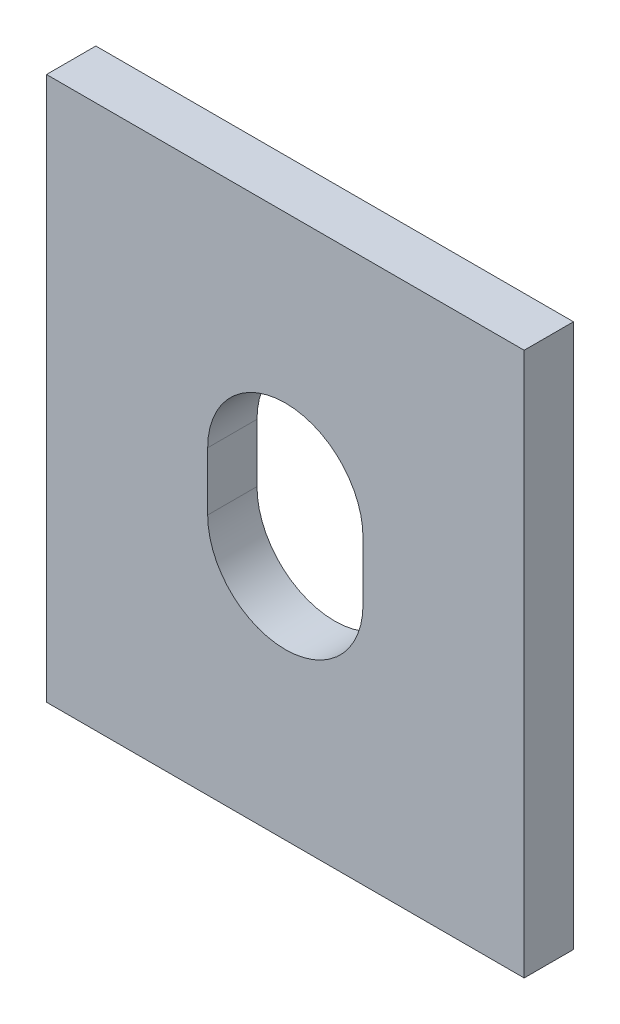
ISO-10303-21;
HEADER;
FILE_DESCRIPTION(('STEP AP214'),'2;1');
FILE_NAME('part.step','',(''),(''),'','','');
FILE_SCHEMA(('AUTOMOTIVE_DESIGN { 1 0 10303 214 1 1 1 1 }'));
ENDSEC;
DATA;
#1=APPLICATION_CONTEXT('core data for automotive mechanical design processes');
#2=APPLICATION_PROTOCOL_DEFINITION('international standard','automotive_design',2000,#1);
#3=PRODUCT_CONTEXT('',#1,'mechanical');
#4=PRODUCT('Part','Part','',(#3));
#5=PRODUCT_RELATED_PRODUCT_CATEGORY('part','',(#4));
#6=PRODUCT_DEFINITION_FORMATION('','',#4);
#7=PRODUCT_DEFINITION_CONTEXT('part definition',#1,'design');
#8=PRODUCT_DEFINITION('design','',#6,#7);
#9=PRODUCT_DEFINITION_SHAPE('','',#8);
#10=(LENGTH_UNIT() NAMED_UNIT(*) SI_UNIT(.MILLI.,.METRE.));
#11=(NAMED_UNIT(*) PLANE_ANGLE_UNIT() SI_UNIT($,.RADIAN.));
#12=(NAMED_UNIT(*) SI_UNIT($,.STERADIAN.) SOLID_ANGLE_UNIT());
#13=UNCERTAINTY_MEASURE_WITH_UNIT(LENGTH_MEASURE(1.E-05),#10,'distance_accuracy_value','');
#14=(GEOMETRIC_REPRESENTATION_CONTEXT(3) GLOBAL_UNCERTAINTY_ASSIGNED_CONTEXT((#13)) GLOBAL_UNIT_ASSIGNED_CONTEXT((#10,
#11,#12)) REPRESENTATION_CONTEXT('',''));
#15=CARTESIAN_POINT('',(0.,0.,0.));
#16=DIRECTION('',(0.,0.,1.));
#17=DIRECTION('',(1.,0.,0.));
#18=AXIS2_PLACEMENT_3D('',#15,#16,#17);
#19=CARTESIAN_POINT('',(-123.,140.,25.4));
#20=DIRECTION('',(1.,0.,0.));
#21=DIRECTION('',(0.,1.,0.));
#22=AXIS2_PLACEMENT_3D('',#19,#20,#21);
#23=PLANE('',#22);
#24=DIRECTION('',(0.,-1.,0.));
#25=VECTOR('',#24,1.);
#26=CARTESIAN_POINT('',(-123.,140.,0.));
#27=LINE('',#26,#25);
#28=CARTESIAN_POINT('',(-123.,140.,0.));
#29=VERTEX_POINT('',#28);
#30=CARTESIAN_POINT('',(-123.,-140.,0.));
#31=VERTEX_POINT('',#30);
#32=EDGE_CURVE('E129',#29,#31,#27,.T.);
#33=ORIENTED_EDGE('',*,*,#32,.T.);
#34=DIRECTION('',(0.,0.,-1.));
#35=VECTOR('',#34,1.);
#36=CARTESIAN_POINT('',(-123.,-140.,25.4));
#37=LINE('',#36,#35);
#38=CARTESIAN_POINT('',(-123.,-140.,25.4));
#39=VERTEX_POINT('',#38);
#40=EDGE_CURVE('E11',#39,#31,#37,.T.);
#41=ORIENTED_EDGE('',*,*,#40,.F.);
#42=DIRECTION('',(0.,-1.,0.));
#43=VECTOR('',#42,1.);
#44=CARTESIAN_POINT('',(-123.,140.,25.4));
#45=LINE('',#44,#43);
#46=CARTESIAN_POINT('',(-123.,140.,25.4));
#47=VERTEX_POINT('',#46);
#48=EDGE_CURVE('E133',#47,#39,#45,.T.);
#49=ORIENTED_EDGE('',*,*,#48,.F.);
#50=DIRECTION('',(0.,0.,-1.));
#51=VECTOR('',#50,1.);
#52=CARTESIAN_POINT('',(-123.,140.,25.4));
#53=LINE('',#52,#51);
#54=EDGE_CURVE('E143',#47,#29,#53,.T.);
#55=ORIENTED_EDGE('',*,*,#54,.T.);
#56=EDGE_LOOP('',(#33,#41,#49,#55));
#57=FACE_BOUND('',#56,.T.);
#58=ADVANCED_FACE('F32',(#57),#23,.F.);
#59=CARTESIAN_POINT('',(-123.,-140.,25.4));
#60=DIRECTION('',(0.,1.,0.));
#61=DIRECTION('',(0.,0.,1.));
#62=AXIS2_PLACEMENT_3D('',#59,#60,#61);
#63=PLANE('',#62);
#64=DIRECTION('',(1.,0.,0.));
#65=VECTOR('',#64,1.);
#66=CARTESIAN_POINT('',(-123.,-140.,0.));
#67=LINE('',#66,#65);
#68=CARTESIAN_POINT('',(123.,-140.,0.));
#69=VERTEX_POINT('',#68);
#70=EDGE_CURVE('E146',#31,#69,#67,.T.);
#71=ORIENTED_EDGE('',*,*,#70,.T.);
#72=DIRECTION('',(0.,0.,-1.));
#73=VECTOR('',#72,1.);
#74=CARTESIAN_POINT('',(123.,-140.,25.4));
#75=LINE('',#74,#73);
#76=CARTESIAN_POINT('',(123.,-140.,25.4));
#77=VERTEX_POINT('',#76);
#78=EDGE_CURVE('E39',#77,#69,#75,.T.);
#79=ORIENTED_EDGE('',*,*,#78,.F.);
#80=DIRECTION('',(1.,0.,0.));
#81=VECTOR('',#80,1.);
#82=CARTESIAN_POINT('',(-123.,-140.,25.4));
#83=LINE('',#82,#81);
#84=EDGE_CURVE('E136',#39,#77,#83,.T.);
#85=ORIENTED_EDGE('',*,*,#84,.F.);
#86=ORIENTED_EDGE('',*,*,#40,.T.);
#87=EDGE_LOOP('',(#71,#79,#85,#86));
#88=FACE_BOUND('',#87,.T.);
#89=ADVANCED_FACE('F174',(#88),#63,.F.);
#90=CARTESIAN_POINT('',(123.,140.,25.4));
#91=DIRECTION('',(-1.,0.,0.));
#92=DIRECTION('',(0.,-1.,0.));
#93=AXIS2_PLACEMENT_3D('',#90,#91,#92);
#94=PLANE('',#93);
#95=DIRECTION('',(0.,1.,0.));
#96=VECTOR('',#95,1.);
#97=CARTESIAN_POINT('',(123.,140.,0.));
#98=LINE('',#97,#96);
#99=CARTESIAN_POINT('',(123.,140.,0.));
#100=VERTEX_POINT('',#99);
#101=EDGE_CURVE('E148',#69,#100,#98,.T.);
#102=ORIENTED_EDGE('',*,*,#101,.T.);
#103=DIRECTION('',(0.,0.,-1.));
#104=VECTOR('',#103,1.);
#105=CARTESIAN_POINT('',(123.,140.,25.4));
#106=LINE('',#105,#104);
#107=CARTESIAN_POINT('',(123.,140.,25.4));
#108=VERTEX_POINT('',#107);
#109=EDGE_CURVE('E153',#108,#100,#106,.T.);
#110=ORIENTED_EDGE('',*,*,#109,.F.);
#111=DIRECTION('',(0.,1.,0.));
#112=VECTOR('',#111,1.);
#113=CARTESIAN_POINT('',(123.,140.,25.4));
#114=LINE('',#113,#112);
#115=EDGE_CURVE('E139',#77,#108,#114,.T.);
#116=ORIENTED_EDGE('',*,*,#115,.F.);
#117=ORIENTED_EDGE('',*,*,#78,.T.);
#118=EDGE_LOOP('',(#102,#110,#116,#117));
#119=FACE_BOUND('',#118,.T.);
#120=ADVANCED_FACE('F160',(#119),#94,.F.);
#121=CARTESIAN_POINT('',(-123.,140.,25.4));
#122=DIRECTION('',(0.,-1.,0.));
#123=DIRECTION('',(0.,0.,-1.));
#124=AXIS2_PLACEMENT_3D('',#121,#122,#123);
#125=PLANE('',#124);
#126=DIRECTION('',(-1.,0.,0.));
#127=VECTOR('',#126,1.);
#128=CARTESIAN_POINT('',(-123.,140.,0.));
#129=LINE('',#128,#127);
#130=EDGE_CURVE('E137',#100,#29,#129,.T.);
#131=ORIENTED_EDGE('',*,*,#130,.T.);
#132=ORIENTED_EDGE('',*,*,#54,.F.);
#133=DIRECTION('',(-1.,0.,0.));
#134=VECTOR('',#133,1.);
#135=CARTESIAN_POINT('',(-123.,140.,25.4));
#136=LINE('',#135,#134);
#137=EDGE_CURVE('E141',#108,#47,#136,.T.);
#138=ORIENTED_EDGE('',*,*,#137,.F.);
#139=ORIENTED_EDGE('',*,*,#109,.T.);
#140=EDGE_LOOP('',(#131,#132,#138,#139));
#141=FACE_BOUND('',#140,.T.);
#142=ADVANCED_FACE('F167',(#141),#125,.F.);
#143=CARTESIAN_POINT('',(0.,0.,25.4));
#144=DIRECTION('',(0.,0.,1.));
#145=DIRECTION('',(1.,0.,0.));
#146=AXIS2_PLACEMENT_3D('',#143,#144,#145);
#147=PLANE('',#146);
#148=CARTESIAN_POINT('',(0.,15.,25.4));
#149=DIRECTION('',(0.,0.,1.));
#150=DIRECTION('',(1.,0.,0.));
#151=AXIS2_PLACEMENT_3D('',#148,#149,#150);
#152=CIRCLE('',#151,40.);
#153=CARTESIAN_POINT('',(40.,15.,25.4));
#154=VERTEX_POINT('',#153);
#155=CARTESIAN_POINT('',(-40.,15.,25.4));
#156=VERTEX_POINT('',#155);
#157=EDGE_CURVE('E46',#154,#156,#152,.T.);
#158=ORIENTED_EDGE('',*,*,#157,.F.);
#159=DIRECTION('',(0.,1.,0.));
#160=VECTOR('',#159,1.);
#161=CARTESIAN_POINT('',(40.,15.,25.4));
#162=LINE('',#161,#160);
#163=CARTESIAN_POINT('',(40.,-15.,25.4));
#164=VERTEX_POINT('',#163);
#165=EDGE_CURVE('E114',#164,#154,#162,.T.);
#166=ORIENTED_EDGE('',*,*,#165,.F.);
#167=CARTESIAN_POINT('',(0.,-15.,25.4));
#168=DIRECTION('',(0.,0.,1.));
#169=DIRECTION('',(1.,0.,0.));
#170=AXIS2_PLACEMENT_3D('',#167,#168,#169);
#171=CIRCLE('',#170,40.);
#172=CARTESIAN_POINT('',(-40.,-15.,25.4));
#173=VERTEX_POINT('',#172);
#174=EDGE_CURVE('E117',#173,#164,#171,.T.);
#175=ORIENTED_EDGE('',*,*,#174,.F.);
#176=DIRECTION('',(0.,-1.,0.));
#177=VECTOR('',#176,1.);
#178=CARTESIAN_POINT('',(-40.,15.,25.4));
#179=LINE('',#178,#177);
#180=EDGE_CURVE('E123',#156,#173,#179,.T.);
#181=ORIENTED_EDGE('',*,*,#180,.F.);
#182=EDGE_LOOP('',(#158,#166,#175,#181));
#183=FACE_BOUND('',#182,.T.);
#184=ORIENTED_EDGE('',*,*,#48,.T.);
#185=ORIENTED_EDGE('',*,*,#84,.T.);
#186=ORIENTED_EDGE('',*,*,#115,.T.);
#187=ORIENTED_EDGE('',*,*,#137,.T.);
#188=EDGE_LOOP('',(#184,#185,#186,#187));
#189=FACE_BOUND('',#188,.T.);
#190=ADVANCED_FACE('F173',(#183,#189),#147,.T.);
#191=CARTESIAN_POINT('',(0.,0.,0.));
#192=DIRECTION('',(0.,0.,1.));
#193=DIRECTION('',(1.,0.,0.));
#194=AXIS2_PLACEMENT_3D('',#191,#192,#193);
#195=PLANE('',#194);
#196=DIRECTION('',(0.,1.,0.));
#197=VECTOR('',#196,1.);
#198=CARTESIAN_POINT('',(40.,15.,0.));
#199=LINE('',#198,#197);
#200=CARTESIAN_POINT('',(40.,-15.,0.));
#201=VERTEX_POINT('',#200);
#202=CARTESIAN_POINT('',(40.,15.,0.));
#203=VERTEX_POINT('',#202);
#204=EDGE_CURVE('E104',#201,#203,#199,.T.);
#205=ORIENTED_EDGE('',*,*,#204,.T.);
#206=CARTESIAN_POINT('',(0.,15.,0.));
#207=DIRECTION('',(0.,0.,1.));
#208=DIRECTION('',(1.,0.,0.));
#209=AXIS2_PLACEMENT_3D('',#206,#207,#208);
#210=CIRCLE('',#209,40.);
#211=CARTESIAN_POINT('',(-40.,15.,0.));
#212=VERTEX_POINT('',#211);
#213=EDGE_CURVE('E98',#203,#212,#210,.T.);
#214=ORIENTED_EDGE('',*,*,#213,.T.);
#215=DIRECTION('',(0.,-1.,0.));
#216=VECTOR('',#215,1.);
#217=CARTESIAN_POINT('',(-40.,15.,0.));
#218=LINE('',#217,#216);
#219=CARTESIAN_POINT('',(-40.,-15.,0.));
#220=VERTEX_POINT('',#219);
#221=EDGE_CURVE('E107',#212,#220,#218,.T.);
#222=ORIENTED_EDGE('',*,*,#221,.T.);
#223=CARTESIAN_POINT('',(0.,-15.,0.));
#224=DIRECTION('',(0.,0.,1.));
#225=DIRECTION('',(1.,0.,0.));
#226=AXIS2_PLACEMENT_3D('',#223,#224,#225);
#227=CIRCLE('',#226,40.);
#228=EDGE_CURVE('E54',#220,#201,#227,.T.);
#229=ORIENTED_EDGE('',*,*,#228,.T.);
#230=EDGE_LOOP('',(#205,#214,#222,#229));
#231=FACE_BOUND('',#230,.T.);
#232=ORIENTED_EDGE('',*,*,#32,.F.);
#233=ORIENTED_EDGE('',*,*,#130,.F.);
#234=ORIENTED_EDGE('',*,*,#101,.F.);
#235=ORIENTED_EDGE('',*,*,#70,.F.);
#236=EDGE_LOOP('',(#232,#233,#234,#235));
#237=FACE_BOUND('',#236,.T.);
#238=ADVANCED_FACE('F111',(#231,#237),#195,.F.);
#239=CARTESIAN_POINT('',(0.,15.,0.));
#240=DIRECTION('',(0.,0.,1.));
#241=DIRECTION('',(1.,0.,0.));
#242=AXIS2_PLACEMENT_3D('',#239,#240,#241);
#243=CYLINDRICAL_SURFACE('',#242,40.);
#244=ORIENTED_EDGE('',*,*,#157,.T.);
#245=DIRECTION('',(0.,0.,1.));
#246=VECTOR('',#245,1.);
#247=CARTESIAN_POINT('',(-40.,15.,0.));
#248=LINE('',#247,#246);
#249=EDGE_CURVE('E94',#212,#156,#248,.T.);
#250=ORIENTED_EDGE('',*,*,#249,.F.);
#251=ORIENTED_EDGE('',*,*,#213,.F.);
#252=DIRECTION('',(0.,0.,1.));
#253=VECTOR('',#252,1.);
#254=CARTESIAN_POINT('',(40.,15.,0.));
#255=LINE('',#254,#253);
#256=EDGE_CURVE('E127',#203,#154,#255,.T.);
#257=ORIENTED_EDGE('',*,*,#256,.T.);
#258=EDGE_LOOP('',(#244,#250,#251,#257));
#259=FACE_BOUND('',#258,.T.);
#260=ADVANCED_FACE('F96',(#259),#243,.F.);
#261=CARTESIAN_POINT('',(40.,15.,0.));
#262=DIRECTION('',(1.,0.,0.));
#263=DIRECTION('',(0.,1.,0.));
#264=AXIS2_PLACEMENT_3D('',#261,#262,#263);
#265=PLANE('',#264);
#266=ORIENTED_EDGE('',*,*,#165,.T.);
#267=ORIENTED_EDGE('',*,*,#256,.F.);
#268=ORIENTED_EDGE('',*,*,#204,.F.);
#269=DIRECTION('',(0.,0.,1.));
#270=VECTOR('',#269,1.);
#271=CARTESIAN_POINT('',(40.,-15.,0.));
#272=LINE('',#271,#270);
#273=EDGE_CURVE('E130',#201,#164,#272,.T.);
#274=ORIENTED_EDGE('',*,*,#273,.T.);
#275=EDGE_LOOP('',(#266,#267,#268,#274));
#276=FACE_BOUND('',#275,.T.);
#277=ADVANCED_FACE('F191',(#276),#265,.F.);
#278=CARTESIAN_POINT('',(0.,-15.,0.));
#279=DIRECTION('',(0.,0.,1.));
#280=DIRECTION('',(1.,0.,0.));
#281=AXIS2_PLACEMENT_3D('',#278,#279,#280);
#282=CYLINDRICAL_SURFACE('',#281,40.);
#283=ORIENTED_EDGE('',*,*,#174,.T.);
#284=ORIENTED_EDGE('',*,*,#273,.F.);
#285=ORIENTED_EDGE('',*,*,#228,.F.);
#286=DIRECTION('',(0.,0.,1.));
#287=VECTOR('',#286,1.);
#288=CARTESIAN_POINT('',(-40.,-15.,0.));
#289=LINE('',#288,#287);
#290=EDGE_CURVE('E103',#220,#173,#289,.T.);
#291=ORIENTED_EDGE('',*,*,#290,.T.);
#292=EDGE_LOOP('',(#283,#284,#285,#291));
#293=FACE_BOUND('',#292,.T.);
#294=ADVANCED_FACE('F194',(#293),#282,.F.);
#295=CARTESIAN_POINT('',(-40.,15.,0.));
#296=DIRECTION('',(-1.,0.,0.));
#297=DIRECTION('',(0.,-1.,0.));
#298=AXIS2_PLACEMENT_3D('',#295,#296,#297);
#299=PLANE('',#298);
#300=ORIENTED_EDGE('',*,*,#180,.T.);
#301=ORIENTED_EDGE('',*,*,#290,.F.);
#302=ORIENTED_EDGE('',*,*,#221,.F.);
#303=ORIENTED_EDGE('',*,*,#249,.T.);
#304=EDGE_LOOP('',(#300,#301,#302,#303));
#305=FACE_BOUND('',#304,.T.);
#306=ADVANCED_FACE('F108',(#305),#299,.F.);
#307=CLOSED_SHELL('',(#58,#89,#120,#142,#190,#238,#260,#277,#294,#306));
#308=MANIFOLD_SOLID_BREP('B2',#307);
#309=ADVANCED_BREP_SHAPE_REPRESENTATION('',(#18,#308),#14);
#310=SHAPE_DEFINITION_REPRESENTATION(#9,#309);
ENDSEC;
END-ISO-10303-21;
